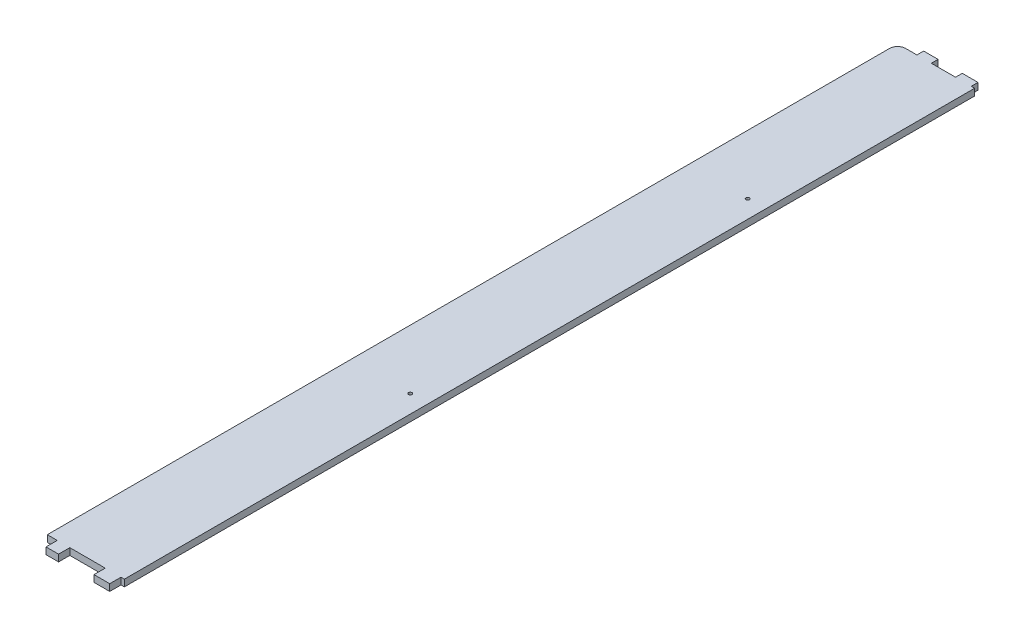
ISO-10303-21;
HEADER;
FILE_DESCRIPTION(('STEP AP214'),'2;1');
FILE_NAME('part.step','',(''),(''),'','','');
FILE_SCHEMA(('AUTOMOTIVE_DESIGN { 1 0 10303 214 1 1 1 1 }'));
ENDSEC;
DATA;
#1=APPLICATION_CONTEXT('core data for automotive mechanical design processes');
#2=APPLICATION_PROTOCOL_DEFINITION('international standard','automotive_design',2000,#1);
#3=PRODUCT_CONTEXT('',#1,'mechanical');
#4=PRODUCT('Part','Part','',(#3));
#5=PRODUCT_RELATED_PRODUCT_CATEGORY('part','',(#4));
#6=PRODUCT_DEFINITION_FORMATION('','',#4);
#7=PRODUCT_DEFINITION_CONTEXT('part definition',#1,'design');
#8=PRODUCT_DEFINITION('design','',#6,#7);
#9=PRODUCT_DEFINITION_SHAPE('','',#8);
#10=(LENGTH_UNIT() NAMED_UNIT(*) SI_UNIT(.MILLI.,.METRE.));
#11=(NAMED_UNIT(*) PLANE_ANGLE_UNIT() SI_UNIT($,.RADIAN.));
#12=(NAMED_UNIT(*) SI_UNIT($,.STERADIAN.) SOLID_ANGLE_UNIT());
#13=UNCERTAINTY_MEASURE_WITH_UNIT(LENGTH_MEASURE(1.E-05),#10,'distance_accuracy_value','');
#14=(GEOMETRIC_REPRESENTATION_CONTEXT(3) GLOBAL_UNCERTAINTY_ASSIGNED_CONTEXT((#13)) GLOBAL_UNIT_ASSIGNED_CONTEXT((#10,
#11,#12)) REPRESENTATION_CONTEXT('',''));
#15=CARTESIAN_POINT('',(0.,0.,0.));
#16=DIRECTION('',(0.,0.,1.));
#17=DIRECTION('',(1.,0.,0.));
#18=AXIS2_PLACEMENT_3D('',#15,#16,#17);
#19=CARTESIAN_POINT('',(-340.910348111348,0.,-10.));
#20=DIRECTION('',(-1.,0.,0.));
#21=DIRECTION('',(0.,-1.,0.));
#22=AXIS2_PLACEMENT_3D('',#19,#20,#21);
#23=PLANE('',#22);
#24=DIRECTION('',(0.,0.,1.));
#25=VECTOR('',#24,1.);
#26=CARTESIAN_POINT('',(-340.910348111348,-6.00000000000006,-10.));
#27=LINE('',#26,#25);
#28=CARTESIAN_POINT('',(-340.910348111348,-6.00000000000001,7.20000000000005));
#29=VERTEX_POINT('',#28);
#30=CARTESIAN_POINT('',(-340.910348111348,-6.00000000000006,756.));
#31=VERTEX_POINT('',#30);
#32=EDGE_CURVE('E196',#29,#31,#27,.T.);
#33=ORIENTED_EDGE('',*,*,#32,.T.);
#34=DIRECTION('',(0.,-1.,0.));
#35=VECTOR('',#34,1.);
#36=CARTESIAN_POINT('',(-340.910348111348,0.,756.));
#37=LINE('',#36,#35);
#38=CARTESIAN_POINT('',(-340.910348111348,0.,756.));
#39=VERTEX_POINT('',#38);
#40=EDGE_CURVE('E178',#39,#31,#37,.T.);
#41=ORIENTED_EDGE('',*,*,#40,.F.);
#42=DIRECTION('',(0.,0.,1.));
#43=VECTOR('',#42,1.);
#44=CARTESIAN_POINT('',(-340.910348111348,0.,-10.));
#45=LINE('',#44,#43);
#46=CARTESIAN_POINT('',(-340.910348111348,0.,7.20000000000005));
#47=VERTEX_POINT('',#46);
#48=EDGE_CURVE('E38',#47,#39,#45,.T.);
#49=ORIENTED_EDGE('',*,*,#48,.F.);
#50=DIRECTION('',(0.,1.,0.));
#51=VECTOR('',#50,1.);
#52=CARTESIAN_POINT('',(-340.910348111348,-6.00000000000001,7.20000000000005));
#53=LINE('',#52,#51);
#54=EDGE_CURVE('E201',#29,#47,#53,.T.);
#55=ORIENTED_EDGE('',*,*,#54,.F.);
#56=EDGE_LOOP('',(#33,#41,#49,#55));
#57=FACE_BOUND('',#56,.T.);
#58=ADVANCED_FACE('F34',(#57),#23,.T.);
#59=CARTESIAN_POINT('',(-272.410348111348,0.,-10.));
#60=DIRECTION('',(0.,1.,0.));
#61=DIRECTION('',(-1.,0.,0.));
#62=AXIS2_PLACEMENT_3D('',#59,#60,#61);
#63=PLANE('',#62);
#64=DIRECTION('',(0.,0.,1.));
#65=VECTOR('',#64,1.);
#66=CARTESIAN_POINT('',(-332.077912059361,0.,756.));
#67=LINE('',#66,#65);
#68=CARTESIAN_POINT('',(-332.077912059361,0.,756.));
#69=VERTEX_POINT('',#68);
#70=CARTESIAN_POINT('',(-332.077912059361,0.,766.));
#71=VERTEX_POINT('',#70);
#72=EDGE_CURVE('E340',#69,#71,#67,.T.);
#73=ORIENTED_EDGE('',*,*,#72,.T.);
#74=DIRECTION('',(-1.,0.,0.));
#75=VECTOR('',#74,1.);
#76=CARTESIAN_POINT('',(-272.410348111348,0.,766.));
#77=LINE('',#76,#75);
#78=CARTESIAN_POINT('',(-320.910348111348,0.,766.));
#79=VERTEX_POINT('',#78);
#80=EDGE_CURVE('E209',#79,#71,#77,.T.);
#81=ORIENTED_EDGE('',*,*,#80,.F.);
#82=DIRECTION('',(0.,0.,1.));
#83=VECTOR('',#82,1.);
#84=CARTESIAN_POINT('',(-320.910348111348,0.,766.));
#85=LINE('',#84,#83);
#86=CARTESIAN_POINT('',(-320.910348111348,0.,756.));
#87=VERTEX_POINT('',#86);
#88=EDGE_CURVE('E228',#87,#79,#85,.T.);
#89=ORIENTED_EDGE('',*,*,#88,.F.);
#90=DIRECTION('',(-1.,0.,0.));
#91=VECTOR('',#90,1.);
#92=CARTESIAN_POINT('',(-320.910348111348,0.,756.));
#93=LINE('',#92,#91);
#94=CARTESIAN_POINT('',(-289.410348111348,0.,756.));
#95=VERTEX_POINT('',#94);
#96=EDGE_CURVE('E221',#95,#87,#93,.T.);
#97=ORIENTED_EDGE('',*,*,#96,.F.);
#98=DIRECTION('',(0.,0.,-1.));
#99=VECTOR('',#98,1.);
#100=CARTESIAN_POINT('',(-289.410348111348,0.,766.));
#101=LINE('',#100,#99);
#102=CARTESIAN_POINT('',(-289.410348111348,0.,766.));
#103=VERTEX_POINT('',#102);
#104=EDGE_CURVE('E225',#103,#95,#101,.T.);
#105=ORIENTED_EDGE('',*,*,#104,.F.);
#106=CARTESIAN_POINT('',(-275.410348111348,0.,766.));
#107=VERTEX_POINT('',#106);
#108=EDGE_CURVE('E207',#107,#103,#77,.T.);
#109=ORIENTED_EDGE('',*,*,#108,.F.);
#110=DIRECTION('',(0.,0.,1.));
#111=VECTOR('',#110,1.);
#112=CARTESIAN_POINT('',(-275.410348111348,0.,766.));
#113=LINE('',#112,#111);
#114=CARTESIAN_POINT('',(-275.410348111348,0.,756.));
#115=VERTEX_POINT('',#114);
#116=EDGE_CURVE('E246',#115,#107,#113,.T.);
#117=ORIENTED_EDGE('',*,*,#116,.F.);
#118=DIRECTION('',(-1.,0.,0.));
#119=VECTOR('',#118,1.);
#120=CARTESIAN_POINT('',(-272.410348111348,0.,756.));
#121=LINE('',#120,#119);
#122=CARTESIAN_POINT('',(-272.410348111348,0.,756.));
#123=VERTEX_POINT('',#122);
#124=EDGE_CURVE('E249',#123,#115,#121,.T.);
#125=ORIENTED_EDGE('',*,*,#124,.F.);
#126=DIRECTION('',(0.,0.,1.));
#127=VECTOR('',#126,1.);
#128=CARTESIAN_POINT('',(-272.410348111348,0.,-10.));
#129=LINE('',#128,#127);
#130=CARTESIAN_POINT('',(-272.410348111348,0.,-4.32986979603811E-12));
#131=VERTEX_POINT('',#130);
#132=EDGE_CURVE('E11',#131,#123,#129,.T.);
#133=ORIENTED_EDGE('',*,*,#132,.F.);
#134=DIRECTION('',(-1.,0.,0.));
#135=VECTOR('',#134,1.);
#136=CARTESIAN_POINT('',(-272.410348111348,0.,-4.32986979603811E-12));
#137=LINE('',#136,#135);
#138=CARTESIAN_POINT('',(-275.410348111348,0.,-4.32986979603811E-12));
#139=VERTEX_POINT('',#138);
#140=EDGE_CURVE('E287',#131,#139,#137,.T.);
#141=ORIENTED_EDGE('',*,*,#140,.T.);
#142=DIRECTION('',(0.,0.,-1.));
#143=VECTOR('',#142,1.);
#144=CARTESIAN_POINT('',(-275.410348111348,0.,-10.0000000000043));
#145=LINE('',#144,#143);
#146=CARTESIAN_POINT('',(-275.410348111348,0.,-6.00000000000423));
#147=VERTEX_POINT('',#146);
#148=EDGE_CURVE('E291',#139,#147,#145,.T.);
#149=ORIENTED_EDGE('',*,*,#148,.T.);
#150=DIRECTION('',(1.,0.,0.));
#151=VECTOR('',#150,1.);
#152=CARTESIAN_POINT('',(-275.410348111348,0.,-6.00000000000423));
#153=LINE('',#152,#151);
#154=CARTESIAN_POINT('',(-289.410348111348,0.,-6.00000000000423));
#155=VERTEX_POINT('',#154);
#156=EDGE_CURVE('E59',#155,#147,#153,.T.);
#157=ORIENTED_EDGE('',*,*,#156,.F.);
#158=DIRECTION('',(0.,0.,1.));
#159=VECTOR('',#158,1.);
#160=CARTESIAN_POINT('',(-289.410348111348,0.,-10.0000000000043));
#161=LINE('',#160,#159);
#162=CARTESIAN_POINT('',(-289.410348111348,0.,-4.32986979603811E-12));
#163=VERTEX_POINT('',#162);
#164=EDGE_CURVE('E272',#155,#163,#161,.T.);
#165=ORIENTED_EDGE('',*,*,#164,.T.);
#166=DIRECTION('',(-1.,0.,0.));
#167=VECTOR('',#166,1.);
#168=CARTESIAN_POINT('',(-320.910348111348,0.,-4.32986979603811E-12));
#169=LINE('',#168,#167);
#170=CARTESIAN_POINT('',(-310.910348111348,0.,0.));
#171=VERTEX_POINT('',#170);
#172=EDGE_CURVE('E275',#163,#171,#169,.T.);
#173=ORIENTED_EDGE('',*,*,#172,.T.);
#174=DIRECTION('',(0.,0.,-1.));
#175=VECTOR('',#174,1.);
#176=CARTESIAN_POINT('',(-310.910348111348,0.,0.));
#177=LINE('',#176,#175);
#178=CARTESIAN_POINT('',(-310.910348111348,0.,-6.));
#179=VERTEX_POINT('',#178);
#180=EDGE_CURVE('E337',#171,#179,#177,.T.);
#181=ORIENTED_EDGE('',*,*,#180,.T.);
#182=CARTESIAN_POINT('',(-323.696161672649,0.,-6.00000000000422));
#183=VERTEX_POINT('',#182);
#184=EDGE_CURVE('E309',#183,#179,#153,.T.);
#185=ORIENTED_EDGE('',*,*,#184,.F.);
#186=DIRECTION('',(0.,0.,-1.));
#187=VECTOR('',#186,1.);
#188=CARTESIAN_POINT('',(-323.696161672649,0.,-6.00000000000422));
#189=LINE('',#188,#187);
#190=CARTESIAN_POINT('',(-323.696161672649,0.,0.));
#191=VERTEX_POINT('',#190);
#192=EDGE_CURVE('E312',#191,#183,#189,.T.);
#193=ORIENTED_EDGE('',*,*,#192,.F.);
#194=DIRECTION('',(1.,0.,0.));
#195=VECTOR('',#194,1.);
#196=CARTESIAN_POINT('',(-323.696161672649,0.,0.));
#197=LINE('',#196,#195);
#198=CARTESIAN_POINT('',(-333.710348111348,0.,0.));
#199=VERTEX_POINT('',#198);
#200=EDGE_CURVE('E315',#199,#191,#197,.T.);
#201=ORIENTED_EDGE('',*,*,#200,.F.);
#202=CARTESIAN_POINT('',(-333.710348111348,0.,7.2));
#203=DIRECTION('',(0.,-1.,0.));
#204=DIRECTION('',(-1.,0.,0.));
#205=AXIS2_PLACEMENT_3D('',#202,#203,#204);
#206=CIRCLE('',#205,7.19999999999999);
#207=EDGE_CURVE('E318',#47,#199,#206,.T.);
#208=ORIENTED_EDGE('',*,*,#207,.F.);
#209=ORIENTED_EDGE('',*,*,#48,.T.);
#210=DIRECTION('',(-1.,0.,0.));
#211=VECTOR('',#210,1.);
#212=CARTESIAN_POINT('',(-340.910348111348,0.,756.));
#213=LINE('',#212,#211);
#214=EDGE_CURVE('E184',#69,#39,#213,.T.);
#215=ORIENTED_EDGE('',*,*,#214,.F.);
#216=EDGE_LOOP('',(#73,#81,#89,#97,#105,#109,#117,#125,#133,#141,#149,#157,#165,#173,#181,#185,
#193,#201,#208,#209,#215));
#217=FACE_BOUND('',#216,.T.);
#218=CARTESIAN_POINT('',(-288.210889387045,0.,186.));
#219=DIRECTION('',(0.,1.,0.));
#220=DIRECTION('',(-1.,0.,0.));
#221=AXIS2_PLACEMENT_3D('',#218,#219,#220);
#222=CIRCLE('',#221,1.55);
#223=CARTESIAN_POINT('',(-289.760889387045,0.,186.));
#224=VERTEX_POINT('',#223);
#225=EDGE_CURVE('E263',#224,#224,#222,.T.);
#226=ORIENTED_EDGE('',*,*,#225,.F.);
#227=EDGE_LOOP('',(#226));
#228=FACE_BOUND('',#227,.T.);
#229=CARTESIAN_POINT('',(-288.210889387045,0.,486.));
#230=DIRECTION('',(0.,1.,0.));
#231=DIRECTION('',(-1.,0.,0.));
#232=AXIS2_PLACEMENT_3D('',#229,#230,#231);
#233=CIRCLE('',#232,1.55);
#234=CARTESIAN_POINT('',(-289.760889387045,0.,486.));
#235=VERTEX_POINT('',#234);
#236=EDGE_CURVE('E257',#235,#235,#233,.T.);
#237=ORIENTED_EDGE('',*,*,#236,.F.);
#238=EDGE_LOOP('',(#237));
#239=FACE_BOUND('',#238,.T.);
#240=ADVANCED_FACE('F36',(#217,#228,#239),#63,.T.);
#241=CARTESIAN_POINT('',(-272.410348111348,-6.00000000000006,-10.));
#242=DIRECTION('',(0.,-1.,0.));
#243=DIRECTION('',(1.,0.,0.));
#244=AXIS2_PLACEMENT_3D('',#241,#242,#243);
#245=PLANE('',#244);
#246=DIRECTION('',(0.,0.,1.));
#247=VECTOR('',#246,1.);
#248=CARTESIAN_POINT('',(-332.077912059361,-5.99999999999995,756.));
#249=LINE('',#248,#247);
#250=CARTESIAN_POINT('',(-332.077912059361,-5.99999999999995,756.));
#251=VERTEX_POINT('',#250);
#252=CARTESIAN_POINT('',(-332.077912059361,-6.00000000000006,766.));
#253=VERTEX_POINT('',#252);
#254=EDGE_CURVE('E51',#251,#253,#249,.T.);
#255=ORIENTED_EDGE('',*,*,#254,.F.);
#256=DIRECTION('',(1.,0.,0.));
#257=VECTOR('',#256,1.);
#258=CARTESIAN_POINT('',(-340.910348111348,-6.00000000000006,756.));
#259=LINE('',#258,#257);
#260=EDGE_CURVE('E182',#31,#251,#259,.T.);
#261=ORIENTED_EDGE('',*,*,#260,.F.);
#262=ORIENTED_EDGE('',*,*,#32,.F.);
#263=CARTESIAN_POINT('',(-333.710348111348,-6.00000000000001,7.2));
#264=DIRECTION('',(0.,-1.,0.));
#265=DIRECTION('',(-1.,0.,0.));
#266=AXIS2_PLACEMENT_3D('',#263,#264,#265);
#267=CIRCLE('',#266,7.19999999999999);
#268=CARTESIAN_POINT('',(-333.710348111348,-6.00000000000001,0.));
#269=VERTEX_POINT('',#268);
#270=EDGE_CURVE('E311',#29,#269,#267,.T.);
#271=ORIENTED_EDGE('',*,*,#270,.T.);
#272=DIRECTION('',(1.,0.,0.));
#273=VECTOR('',#272,1.);
#274=CARTESIAN_POINT('',(-323.696161672649,-6.00000000000001,0.));
#275=LINE('',#274,#273);
#276=CARTESIAN_POINT('',(-323.696161672649,-6.00000000000001,0.));
#277=VERTEX_POINT('',#276);
#278=EDGE_CURVE('E327',#269,#277,#275,.T.);
#279=ORIENTED_EDGE('',*,*,#278,.T.);
#280=DIRECTION('',(0.,0.,-1.));
#281=VECTOR('',#280,1.);
#282=CARTESIAN_POINT('',(-323.696161672649,-6.00000000000001,-6.00000000000422));
#283=LINE('',#282,#281);
#284=CARTESIAN_POINT('',(-323.696161672649,-6.00000000000001,-6.00000000000422));
#285=VERTEX_POINT('',#284);
#286=EDGE_CURVE('E324',#277,#285,#283,.T.);
#287=ORIENTED_EDGE('',*,*,#286,.T.);
#288=DIRECTION('',(1.,0.,0.));
#289=VECTOR('',#288,1.);
#290=CARTESIAN_POINT('',(-275.410348111348,-6.00000000000001,-6.00000000000423));
#291=LINE('',#290,#289);
#292=CARTESIAN_POINT('',(-310.910348111348,-6.00000000000001,-6.));
#293=VERTEX_POINT('',#292);
#294=EDGE_CURVE('E302',#285,#293,#291,.T.);
#295=ORIENTED_EDGE('',*,*,#294,.T.);
#296=DIRECTION('',(0.,0.,-1.));
#297=VECTOR('',#296,1.);
#298=CARTESIAN_POINT('',(-310.910348111348,-6.00000000000001,0.));
#299=LINE('',#298,#297);
#300=CARTESIAN_POINT('',(-310.910348111348,-6.00000000000001,0.));
#301=VERTEX_POINT('',#300);
#302=EDGE_CURVE('E334',#301,#293,#299,.T.);
#303=ORIENTED_EDGE('',*,*,#302,.F.);
#304=DIRECTION('',(-1.,0.,0.));
#305=VECTOR('',#304,1.);
#306=CARTESIAN_POINT('',(-320.910348111348,-6.00000000000001,-4.32987158617554E-12));
#307=LINE('',#306,#305);
#308=CARTESIAN_POINT('',(-289.410348111348,-6.00000000000001,-4.32987158617554E-12));
#309=VERTEX_POINT('',#308);
#310=EDGE_CURVE('E274',#309,#301,#307,.T.);
#311=ORIENTED_EDGE('',*,*,#310,.F.);
#312=DIRECTION('',(0.,0.,1.));
#313=VECTOR('',#312,1.);
#314=CARTESIAN_POINT('',(-289.410348111348,-6.00000000000001,-10.0000000000043));
#315=LINE('',#314,#313);
#316=CARTESIAN_POINT('',(-289.410348111348,-6.00000000000001,-6.00000000000423));
#317=VERTEX_POINT('',#316);
#318=EDGE_CURVE('E271',#317,#309,#315,.T.);
#319=ORIENTED_EDGE('',*,*,#318,.F.);
#320=CARTESIAN_POINT('',(-275.410348111348,-6.00000000000001,-6.00000000000423));
#321=VERTEX_POINT('',#320);
#322=EDGE_CURVE('E323',#317,#321,#291,.T.);
#323=ORIENTED_EDGE('',*,*,#322,.T.);
#324=DIRECTION('',(0.,0.,-1.));
#325=VECTOR('',#324,1.);
#326=CARTESIAN_POINT('',(-275.410348111348,-6.00000000000001,-10.0000000000043));
#327=LINE('',#326,#325);
#328=CARTESIAN_POINT('',(-275.410348111348,-6.00000000000001,-4.32987158617554E-12));
#329=VERTEX_POINT('',#328);
#330=EDGE_CURVE('E290',#329,#321,#327,.T.);
#331=ORIENTED_EDGE('',*,*,#330,.F.);
#332=DIRECTION('',(-1.,0.,0.));
#333=VECTOR('',#332,1.);
#334=CARTESIAN_POINT('',(-272.410348111348,-6.00000000000001,-4.32987158617554E-12));
#335=LINE('',#334,#333);
#336=CARTESIAN_POINT('',(-272.410348111348,-6.00000000000001,-4.32987158617554E-12));
#337=VERTEX_POINT('',#336);
#338=EDGE_CURVE('E284',#337,#329,#335,.T.);
#339=ORIENTED_EDGE('',*,*,#338,.F.);
#340=DIRECTION('',(0.,0.,1.));
#341=VECTOR('',#340,1.);
#342=CARTESIAN_POINT('',(-272.410348111348,-6.00000000000006,-10.));
#343=LINE('',#342,#341);
#344=CARTESIAN_POINT('',(-272.410348111348,-6.00000000000001,756.));
#345=VERTEX_POINT('',#344);
#346=EDGE_CURVE('E43',#337,#345,#343,.T.);
#347=ORIENTED_EDGE('',*,*,#346,.T.);
#348=DIRECTION('',(-1.,0.,0.));
#349=VECTOR('',#348,1.);
#350=CARTESIAN_POINT('',(-272.410348111348,-6.00000000000001,756.));
#351=LINE('',#350,#349);
#352=CARTESIAN_POINT('',(-275.410348111348,-6.00000000000001,756.));
#353=VERTEX_POINT('',#352);
#354=EDGE_CURVE('E248',#345,#353,#351,.T.);
#355=ORIENTED_EDGE('',*,*,#354,.T.);
#356=DIRECTION('',(0.,0.,1.));
#357=VECTOR('',#356,1.);
#358=CARTESIAN_POINT('',(-275.410348111348,-6.00000000000001,766.));
#359=LINE('',#358,#357);
#360=CARTESIAN_POINT('',(-275.410348111348,-6.00000000000001,766.));
#361=VERTEX_POINT('',#360);
#362=EDGE_CURVE('E242',#353,#361,#359,.T.);
#363=ORIENTED_EDGE('',*,*,#362,.T.);
#364=DIRECTION('',(1.,0.,0.));
#365=VECTOR('',#364,1.);
#366=CARTESIAN_POINT('',(-272.410348111348,-6.00000000000006,766.));
#367=LINE('',#366,#365);
#368=CARTESIAN_POINT('',(-289.410348111348,-6.00000000000006,766.));
#369=VERTEX_POINT('',#368);
#370=EDGE_CURVE('E206',#369,#361,#367,.T.);
#371=ORIENTED_EDGE('',*,*,#370,.F.);
#372=DIRECTION('',(0.,0.,-1.));
#373=VECTOR('',#372,1.);
#374=CARTESIAN_POINT('',(-289.410348111348,-6.00000000000001,766.));
#375=LINE('',#374,#373);
#376=CARTESIAN_POINT('',(-289.410348111348,-6.00000000000001,756.));
#377=VERTEX_POINT('',#376);
#378=EDGE_CURVE('E233',#369,#377,#375,.T.);
#379=ORIENTED_EDGE('',*,*,#378,.T.);
#380=DIRECTION('',(-1.,0.,0.));
#381=VECTOR('',#380,1.);
#382=CARTESIAN_POINT('',(-320.910348111348,-6.00000000000001,756.));
#383=LINE('',#382,#381);
#384=CARTESIAN_POINT('',(-320.910348111348,-6.00000000000001,756.));
#385=VERTEX_POINT('',#384);
#386=EDGE_CURVE('E214',#377,#385,#383,.T.);
#387=ORIENTED_EDGE('',*,*,#386,.T.);
#388=DIRECTION('',(0.,0.,1.));
#389=VECTOR('',#388,1.);
#390=CARTESIAN_POINT('',(-320.910348111348,-6.00000000000001,766.));
#391=LINE('',#390,#389);
#392=CARTESIAN_POINT('',(-320.910348111348,-6.00000000000001,766.));
#393=VERTEX_POINT('',#392);
#394=EDGE_CURVE('E224',#385,#393,#391,.T.);
#395=ORIENTED_EDGE('',*,*,#394,.T.);
#396=EDGE_CURVE('E203',#253,#393,#367,.T.);
#397=ORIENTED_EDGE('',*,*,#396,.F.);
#398=EDGE_LOOP('',(#255,#261,#262,#271,#279,#287,#295,#303,#311,#319,#323,#331,#339,#347,#355,
#363,#371,#379,#387,#395,#397));
#399=FACE_BOUND('',#398,.T.);
#400=CARTESIAN_POINT('',(-288.210889387045,-6.00000000000001,186.));
#401=DIRECTION('',(0.,1.,0.));
#402=DIRECTION('',(-1.,0.,0.));
#403=AXIS2_PLACEMENT_3D('',#400,#401,#402);
#404=CIRCLE('',#403,1.55);
#405=CARTESIAN_POINT('',(-289.760889387045,-6.00000000000001,186.));
#406=VERTEX_POINT('',#405);
#407=EDGE_CURVE('E260',#406,#406,#404,.T.);
#408=ORIENTED_EDGE('',*,*,#407,.T.);
#409=EDGE_LOOP('',(#408));
#410=FACE_BOUND('',#409,.T.);
#411=CARTESIAN_POINT('',(-288.210889387045,-6.00000000000001,486.));
#412=DIRECTION('',(0.,1.,0.));
#413=DIRECTION('',(-1.,0.,0.));
#414=AXIS2_PLACEMENT_3D('',#411,#412,#413);
#415=CIRCLE('',#414,1.55);
#416=CARTESIAN_POINT('',(-289.760889387045,-6.00000000000001,486.));
#417=VERTEX_POINT('',#416);
#418=EDGE_CURVE('E252',#417,#417,#415,.T.);
#419=ORIENTED_EDGE('',*,*,#418,.T.);
#420=EDGE_LOOP('',(#419));
#421=FACE_BOUND('',#420,.T.);
#422=ADVANCED_FACE('F193',(#399,#410,#421),#245,.T.);
#423=CARTESIAN_POINT('',(-272.410348111348,0.,-10.));
#424=DIRECTION('',(1.,0.,0.));
#425=DIRECTION('',(0.,1.,0.));
#426=AXIS2_PLACEMENT_3D('',#423,#424,#425);
#427=PLANE('',#426);
#428=ORIENTED_EDGE('',*,*,#346,.F.);
#429=DIRECTION('',(0.,1.,0.));
#430=VECTOR('',#429,1.);
#431=CARTESIAN_POINT('',(-272.410348111348,-6.00000000000001,-4.32987158617554E-12));
#432=LINE('',#431,#430);
#433=EDGE_CURVE('E278',#337,#131,#432,.T.);
#434=ORIENTED_EDGE('',*,*,#433,.T.);
#435=ORIENTED_EDGE('',*,*,#132,.T.);
#436=DIRECTION('',(0.,1.,0.));
#437=VECTOR('',#436,1.);
#438=CARTESIAN_POINT('',(-272.410348111348,-6.00000000000001,756.));
#439=LINE('',#438,#437);
#440=EDGE_CURVE('E238',#345,#123,#439,.T.);
#441=ORIENTED_EDGE('',*,*,#440,.F.);
#442=EDGE_LOOP('',(#428,#434,#435,#441));
#443=FACE_BOUND('',#442,.T.);
#444=ADVANCED_FACE('F393',(#443),#427,.T.);
#445=CARTESIAN_POINT('',(64.9860548549651,344.721414140742,766.));
#446=DIRECTION('',(0.,0.,1.));
#447=DIRECTION('',(0.984807753012207,-0.173648177666934,0.));
#448=AXIS2_PLACEMENT_3D('',#445,#446,#447);
#449=PLANE('',#448);
#450=DIRECTION('',(0.,1.,0.));
#451=VECTOR('',#450,1.);
#452=CARTESIAN_POINT('',(-332.077912059361,0.,766.));
#453=LINE('',#452,#451);
#454=EDGE_CURVE('E189',#253,#71,#453,.T.);
#455=ORIENTED_EDGE('',*,*,#454,.F.);
#456=ORIENTED_EDGE('',*,*,#396,.T.);
#457=DIRECTION('',(0.,1.,0.));
#458=VECTOR('',#457,1.);
#459=CARTESIAN_POINT('',(-320.910348111348,-6.00000000000001,766.));
#460=LINE('',#459,#458);
#461=EDGE_CURVE('E210',#393,#79,#460,.T.);
#462=ORIENTED_EDGE('',*,*,#461,.T.);
#463=ORIENTED_EDGE('',*,*,#80,.T.);
#464=EDGE_LOOP('',(#455,#456,#462,#463));
#465=FACE_BOUND('',#464,.T.);
#466=ADVANCED_FACE('F421',(#465),#449,.T.);
#467=DIRECTION('',(0.,1.,0.));
#468=VECTOR('',#467,1.);
#469=CARTESIAN_POINT('',(-275.410348111348,-6.00000000000001,766.));
#470=LINE('',#469,#468);
#471=EDGE_CURVE('E230',#361,#107,#470,.T.);
#472=ORIENTED_EDGE('',*,*,#471,.T.);
#473=ORIENTED_EDGE('',*,*,#108,.T.);
#474=DIRECTION('',(0.,1.,0.));
#475=VECTOR('',#474,1.);
#476=CARTESIAN_POINT('',(-289.410348111348,-6.00000000000001,766.));
#477=LINE('',#476,#475);
#478=EDGE_CURVE('E213',#369,#103,#477,.T.);
#479=ORIENTED_EDGE('',*,*,#478,.F.);
#480=ORIENTED_EDGE('',*,*,#370,.T.);
#481=EDGE_LOOP('',(#472,#473,#479,#480));
#482=FACE_BOUND('',#481,.T.);
#483=ADVANCED_FACE('F406',(#482),#449,.T.);
#484=CARTESIAN_POINT('',(-320.910348111348,-6.00000000000001,766.));
#485=DIRECTION('',(-1.,0.,0.));
#486=DIRECTION('',(0.,-1.,0.));
#487=AXIS2_PLACEMENT_3D('',#484,#485,#486);
#488=PLANE('',#487);
#489=ORIENTED_EDGE('',*,*,#88,.T.);
#490=ORIENTED_EDGE('',*,*,#461,.F.);
#491=ORIENTED_EDGE('',*,*,#394,.F.);
#492=DIRECTION('',(0.,1.,0.));
#493=VECTOR('',#492,1.);
#494=CARTESIAN_POINT('',(-320.910348111348,-6.00000000000001,756.));
#495=LINE('',#494,#493);
#496=EDGE_CURVE('E219',#385,#87,#495,.T.);
#497=ORIENTED_EDGE('',*,*,#496,.T.);
#498=EDGE_LOOP('',(#489,#490,#491,#497));
#499=FACE_BOUND('',#498,.T.);
#500=ADVANCED_FACE('F419',(#499),#488,.F.);
#501=CARTESIAN_POINT('',(-320.910348111348,-6.00000000000001,756.));
#502=DIRECTION('',(0.,0.,-1.));
#503=DIRECTION('',(-1.,0.,0.));
#504=AXIS2_PLACEMENT_3D('',#501,#502,#503);
#505=PLANE('',#504);
#506=ORIENTED_EDGE('',*,*,#96,.T.);
#507=ORIENTED_EDGE('',*,*,#496,.F.);
#508=ORIENTED_EDGE('',*,*,#386,.F.);
#509=DIRECTION('',(0.,1.,0.));
#510=VECTOR('',#509,1.);
#511=CARTESIAN_POINT('',(-289.410348111348,-6.00000000000001,756.));
#512=LINE('',#511,#510);
#513=EDGE_CURVE('E217',#377,#95,#512,.T.);
#514=ORIENTED_EDGE('',*,*,#513,.T.);
#515=EDGE_LOOP('',(#506,#507,#508,#514));
#516=FACE_BOUND('',#515,.T.);
#517=ADVANCED_FACE('F414',(#516),#505,.F.);
#518=CARTESIAN_POINT('',(-289.410348111348,-6.00000000000001,766.));
#519=DIRECTION('',(1.,0.,0.));
#520=DIRECTION('',(0.,1.,0.));
#521=AXIS2_PLACEMENT_3D('',#518,#519,#520);
#522=PLANE('',#521);
#523=ORIENTED_EDGE('',*,*,#104,.T.);
#524=ORIENTED_EDGE('',*,*,#513,.F.);
#525=ORIENTED_EDGE('',*,*,#378,.F.);
#526=ORIENTED_EDGE('',*,*,#478,.T.);
#527=EDGE_LOOP('',(#523,#524,#525,#526));
#528=FACE_BOUND('',#527,.T.);
#529=ADVANCED_FACE('F411',(#528),#522,.F.);
#530=CARTESIAN_POINT('',(-275.410348111348,-6.00000000000001,766.));
#531=DIRECTION('',(-1.,0.,0.));
#532=DIRECTION('',(0.,-1.,0.));
#533=AXIS2_PLACEMENT_3D('',#530,#531,#532);
#534=PLANE('',#533);
#535=ORIENTED_EDGE('',*,*,#116,.T.);
#536=ORIENTED_EDGE('',*,*,#471,.F.);
#537=ORIENTED_EDGE('',*,*,#362,.F.);
#538=DIRECTION('',(0.,1.,0.));
#539=VECTOR('',#538,1.);
#540=CARTESIAN_POINT('',(-275.410348111348,-6.00000000000001,756.));
#541=LINE('',#540,#539);
#542=EDGE_CURVE('E241',#353,#115,#541,.T.);
#543=ORIENTED_EDGE('',*,*,#542,.T.);
#544=EDGE_LOOP('',(#535,#536,#537,#543));
#545=FACE_BOUND('',#544,.T.);
#546=ADVANCED_FACE('F402',(#545),#534,.F.);
#547=CARTESIAN_POINT('',(-272.410348111348,-6.00000000000001,756.));
#548=DIRECTION('',(0.,0.,-1.));
#549=DIRECTION('',(-1.,0.,0.));
#550=AXIS2_PLACEMENT_3D('',#547,#548,#549);
#551=PLANE('',#550);
#552=ORIENTED_EDGE('',*,*,#124,.T.);
#553=ORIENTED_EDGE('',*,*,#542,.F.);
#554=ORIENTED_EDGE('',*,*,#354,.F.);
#555=ORIENTED_EDGE('',*,*,#440,.T.);
#556=EDGE_LOOP('',(#552,#553,#554,#555));
#557=FACE_BOUND('',#556,.T.);
#558=ADVANCED_FACE('F397',(#557),#551,.F.);
#559=CARTESIAN_POINT('',(-288.210889387045,-6.00000000000001,486.));
#560=DIRECTION('',(0.,1.,0.));
#561=DIRECTION('',(-1.,0.,0.));
#562=AXIS2_PLACEMENT_3D('',#559,#560,#561);
#563=CYLINDRICAL_SURFACE('',#562,1.55);
#564=ORIENTED_EDGE('',*,*,#418,.F.);
#565=EDGE_LOOP('',(#564));
#566=FACE_BOUND('',#565,.T.);
#567=ORIENTED_EDGE('',*,*,#236,.T.);
#568=EDGE_LOOP('',(#567));
#569=FACE_BOUND('',#568,.T.);
#570=ADVANCED_FACE('F451',(#566,#569),#563,.F.);
#571=CARTESIAN_POINT('',(-288.210889387045,-6.00000000000001,186.));
#572=DIRECTION('',(0.,1.,0.));
#573=DIRECTION('',(-1.,0.,0.));
#574=AXIS2_PLACEMENT_3D('',#571,#572,#573);
#575=CYLINDRICAL_SURFACE('',#574,1.55);
#576=ORIENTED_EDGE('',*,*,#407,.F.);
#577=EDGE_LOOP('',(#576));
#578=FACE_BOUND('',#577,.T.);
#579=ORIENTED_EDGE('',*,*,#225,.T.);
#580=EDGE_LOOP('',(#579));
#581=FACE_BOUND('',#580,.T.);
#582=ADVANCED_FACE('F456',(#578,#581),#575,.F.);
#583=CARTESIAN_POINT('',(-289.410348111348,-6.00000000000001,-10.0000000000043));
#584=DIRECTION('',(-1.,0.,0.));
#585=DIRECTION('',(0.,-1.,0.));
#586=AXIS2_PLACEMENT_3D('',#583,#584,#585);
#587=PLANE('',#586);
#588=DIRECTION('',(0.,1.,0.));
#589=VECTOR('',#588,1.);
#590=CARTESIAN_POINT('',(-289.410348111348,-6.00000000000001,-6.00000000000423));
#591=LINE('',#590,#589);
#592=EDGE_CURVE('E294',#317,#155,#591,.T.);
#593=ORIENTED_EDGE('',*,*,#592,.F.);
#594=ORIENTED_EDGE('',*,*,#318,.T.);
#595=DIRECTION('',(0.,1.,0.));
#596=VECTOR('',#595,1.);
#597=CARTESIAN_POINT('',(-289.410348111348,-6.00000000000001,-4.32987158617554E-12));
#598=LINE('',#597,#596);
#599=EDGE_CURVE('E266',#309,#163,#598,.T.);
#600=ORIENTED_EDGE('',*,*,#599,.T.);
#601=ORIENTED_EDGE('',*,*,#164,.F.);
#602=EDGE_LOOP('',(#593,#594,#600,#601));
#603=FACE_BOUND('',#602,.T.);
#604=ADVANCED_FACE('F379',(#603),#587,.T.);
#605=CARTESIAN_POINT('',(-320.910348111348,-6.00000000000001,-4.32987158617554E-12));
#606=DIRECTION('',(0.,0.,-1.));
#607=DIRECTION('',(-1.,0.,0.));
#608=AXIS2_PLACEMENT_3D('',#605,#606,#607);
#609=PLANE('',#608);
#610=DIRECTION('',(0.,1.,0.));
#611=VECTOR('',#610,1.);
#612=CARTESIAN_POINT('',(-310.910348111348,-6.00000000000001,0.));
#613=LINE('',#612,#611);
#614=EDGE_CURVE('E321',#301,#171,#613,.T.);
#615=ORIENTED_EDGE('',*,*,#614,.T.);
#616=ORIENTED_EDGE('',*,*,#172,.F.);
#617=ORIENTED_EDGE('',*,*,#599,.F.);
#618=ORIENTED_EDGE('',*,*,#310,.T.);
#619=EDGE_LOOP('',(#615,#616,#617,#618));
#620=FACE_BOUND('',#619,.T.);
#621=ADVANCED_FACE('F374',(#620),#609,.T.);
#622=CARTESIAN_POINT('',(-272.410348111348,-6.00000000000001,-4.32987158617554E-12));
#623=DIRECTION('',(0.,0.,-1.));
#624=DIRECTION('',(-1.,0.,0.));
#625=AXIS2_PLACEMENT_3D('',#622,#623,#624);
#626=PLANE('',#625);
#627=ORIENTED_EDGE('',*,*,#140,.F.);
#628=ORIENTED_EDGE('',*,*,#433,.F.);
#629=ORIENTED_EDGE('',*,*,#338,.T.);
#630=DIRECTION('',(0.,1.,0.));
#631=VECTOR('',#630,1.);
#632=CARTESIAN_POINT('',(-275.410348111348,-6.00000000000001,-4.32987158617554E-12));
#633=LINE('',#632,#631);
#634=EDGE_CURVE('E282',#329,#139,#633,.T.);
#635=ORIENTED_EDGE('',*,*,#634,.T.);
#636=EDGE_LOOP('',(#627,#628,#629,#635));
#637=FACE_BOUND('',#636,.T.);
#638=ADVANCED_FACE('F388',(#637),#626,.T.);
#639=CARTESIAN_POINT('',(-275.410348111348,-6.00000000000001,-10.0000000000043));
#640=DIRECTION('',(1.,0.,0.));
#641=DIRECTION('',(0.,1.,0.));
#642=AXIS2_PLACEMENT_3D('',#639,#640,#641);
#643=PLANE('',#642);
#644=DIRECTION('',(0.,1.,0.));
#645=VECTOR('',#644,1.);
#646=CARTESIAN_POINT('',(-275.410348111348,-6.00000000000001,-6.00000000000423));
#647=LINE('',#646,#645);
#648=EDGE_CURVE('E299',#321,#147,#647,.T.);
#649=ORIENTED_EDGE('',*,*,#648,.T.);
#650=ORIENTED_EDGE('',*,*,#148,.F.);
#651=ORIENTED_EDGE('',*,*,#634,.F.);
#652=ORIENTED_EDGE('',*,*,#330,.T.);
#653=EDGE_LOOP('',(#649,#650,#651,#652));
#654=FACE_BOUND('',#653,.T.);
#655=ADVANCED_FACE('F385',(#654),#643,.T.);
#656=CARTESIAN_POINT('',(-275.410348111348,-6.00000000000001,-6.00000000000423));
#657=DIRECTION('',(0.,0.,1.));
#658=DIRECTION('',(1.,0.,0.));
#659=AXIS2_PLACEMENT_3D('',#656,#657,#658);
#660=PLANE('',#659);
#661=ORIENTED_EDGE('',*,*,#592,.T.);
#662=ORIENTED_EDGE('',*,*,#156,.T.);
#663=ORIENTED_EDGE('',*,*,#648,.F.);
#664=ORIENTED_EDGE('',*,*,#322,.F.);
#665=EDGE_LOOP('',(#661,#662,#663,#664));
#666=FACE_BOUND('',#665,.T.);
#667=ADVANCED_FACE('F467',(#666),#660,.F.);
#668=ORIENTED_EDGE('',*,*,#184,.T.);
#669=DIRECTION('',(0.,1.,0.));
#670=VECTOR('',#669,1.);
#671=CARTESIAN_POINT('',(-310.910348111348,-6.00000000000001,-6.));
#672=LINE('',#671,#670);
#673=EDGE_CURVE('E331',#293,#179,#672,.T.);
#674=ORIENTED_EDGE('',*,*,#673,.F.);
#675=ORIENTED_EDGE('',*,*,#294,.F.);
#676=DIRECTION('',(0.,1.,0.));
#677=VECTOR('',#676,1.);
#678=CARTESIAN_POINT('',(-323.696161672649,-6.00000000000001,-6.00000000000422));
#679=LINE('',#678,#677);
#680=EDGE_CURVE('E306',#285,#183,#679,.T.);
#681=ORIENTED_EDGE('',*,*,#680,.T.);
#682=EDGE_LOOP('',(#668,#674,#675,#681));
#683=FACE_BOUND('',#682,.T.);
#684=ADVANCED_FACE('F367',(#683),#660,.F.);
#685=CARTESIAN_POINT('',(-323.696161672649,-6.00000000000001,-6.00000000000422));
#686=DIRECTION('',(1.,0.,0.));
#687=DIRECTION('',(0.,1.,0.));
#688=AXIS2_PLACEMENT_3D('',#685,#686,#687);
#689=PLANE('',#688);
#690=ORIENTED_EDGE('',*,*,#192,.T.);
#691=ORIENTED_EDGE('',*,*,#680,.F.);
#692=ORIENTED_EDGE('',*,*,#286,.F.);
#693=DIRECTION('',(0.,1.,0.));
#694=VECTOR('',#693,1.);
#695=CARTESIAN_POINT('',(-323.696161672649,-6.00000000000001,0.));
#696=LINE('',#695,#694);
#697=EDGE_CURVE('E304',#277,#191,#696,.T.);
#698=ORIENTED_EDGE('',*,*,#697,.T.);
#699=EDGE_LOOP('',(#690,#691,#692,#698));
#700=FACE_BOUND('',#699,.T.);
#701=ADVANCED_FACE('F362',(#700),#689,.F.);
#702=CARTESIAN_POINT('',(-323.696161672649,-6.00000000000001,0.));
#703=DIRECTION('',(0.,0.,1.));
#704=DIRECTION('',(1.,0.,0.));
#705=AXIS2_PLACEMENT_3D('',#702,#703,#704);
#706=PLANE('',#705);
#707=ORIENTED_EDGE('',*,*,#200,.T.);
#708=ORIENTED_EDGE('',*,*,#697,.F.);
#709=ORIENTED_EDGE('',*,*,#278,.F.);
#710=DIRECTION('',(0.,1.,0.));
#711=VECTOR('',#710,1.);
#712=CARTESIAN_POINT('',(-333.710348111348,-6.00000000000001,0.));
#713=LINE('',#712,#711);
#714=EDGE_CURVE('E301',#269,#199,#713,.T.);
#715=ORIENTED_EDGE('',*,*,#714,.T.);
#716=EDGE_LOOP('',(#707,#708,#709,#715));
#717=FACE_BOUND('',#716,.T.);
#718=ADVANCED_FACE('F360',(#717),#706,.F.);
#719=CARTESIAN_POINT('',(-333.710348111348,-6.00000000000001,7.2));
#720=DIRECTION('',(0.,1.,0.));
#721=DIRECTION('',(-1.,0.,0.));
#722=AXIS2_PLACEMENT_3D('',#719,#720,#721);
#723=CYLINDRICAL_SURFACE('',#722,7.19999999999999);
#724=ORIENTED_EDGE('',*,*,#207,.T.);
#725=ORIENTED_EDGE('',*,*,#714,.F.);
#726=ORIENTED_EDGE('',*,*,#270,.F.);
#727=ORIENTED_EDGE('',*,*,#54,.T.);
#728=EDGE_LOOP('',(#724,#725,#726,#727));
#729=FACE_BOUND('',#728,.T.);
#730=ADVANCED_FACE('F356',(#729),#723,.T.);
#731=CARTESIAN_POINT('',(-310.910348111348,-6.00000000000001,0.));
#732=DIRECTION('',(1.,0.,0.));
#733=DIRECTION('',(0.,1.,0.));
#734=AXIS2_PLACEMENT_3D('',#731,#732,#733);
#735=PLANE('',#734);
#736=ORIENTED_EDGE('',*,*,#180,.F.);
#737=ORIENTED_EDGE('',*,*,#614,.F.);
#738=ORIENTED_EDGE('',*,*,#302,.T.);
#739=ORIENTED_EDGE('',*,*,#673,.T.);
#740=EDGE_LOOP('',(#736,#737,#738,#739));
#741=FACE_BOUND('',#740,.T.);
#742=ADVANCED_FACE('F424',(#741),#735,.T.);
#743=CARTESIAN_POINT('',(-332.077912059361,0.,756.));
#744=DIRECTION('',(1.,0.,0.));
#745=DIRECTION('',(0.,0.,-1.));
#746=AXIS2_PLACEMENT_3D('',#743,#744,#745);
#747=PLANE('',#746);
#748=ORIENTED_EDGE('',*,*,#454,.T.);
#749=ORIENTED_EDGE('',*,*,#72,.F.);
#750=DIRECTION('',(0.,1.,0.));
#751=VECTOR('',#750,1.);
#752=CARTESIAN_POINT('',(-332.077912059361,0.,756.));
#753=LINE('',#752,#751);
#754=EDGE_CURVE('E198',#251,#69,#753,.T.);
#755=ORIENTED_EDGE('',*,*,#754,.F.);
#756=ORIENTED_EDGE('',*,*,#254,.T.);
#757=EDGE_LOOP('',(#748,#749,#755,#756));
#758=FACE_BOUND('',#757,.T.);
#759=ADVANCED_FACE('F422',(#758),#747,.F.);
#760=CARTESIAN_POINT('',(0.,0.,756.));
#761=DIRECTION('',(0.,0.,1.));
#762=DIRECTION('',(1.,0.,0.));
#763=AXIS2_PLACEMENT_3D('',#760,#761,#762);
#764=PLANE('',#763);
#765=ORIENTED_EDGE('',*,*,#40,.T.);
#766=ORIENTED_EDGE('',*,*,#260,.T.);
#767=ORIENTED_EDGE('',*,*,#754,.T.);
#768=ORIENTED_EDGE('',*,*,#214,.T.);
#769=EDGE_LOOP('',(#765,#766,#767,#768));
#770=FACE_BOUND('',#769,.T.);
#771=ADVANCED_FACE('F180',(#770),#764,.T.);
#772=CLOSED_SHELL('',(#58,#240,#422,#444,#466,#483,#500,#517,#529,#546,#558,#570,#582,#604,#621,
#638,#655,#667,#684,#701,#718,#730,#742,#759,#771));
#773=MANIFOLD_SOLID_BREP('B2',#772);
#774=ADVANCED_BREP_SHAPE_REPRESENTATION('',(#18,#773),#14);
#775=SHAPE_DEFINITION_REPRESENTATION(#9,#774);
ENDSEC;
END-ISO-10303-21;
